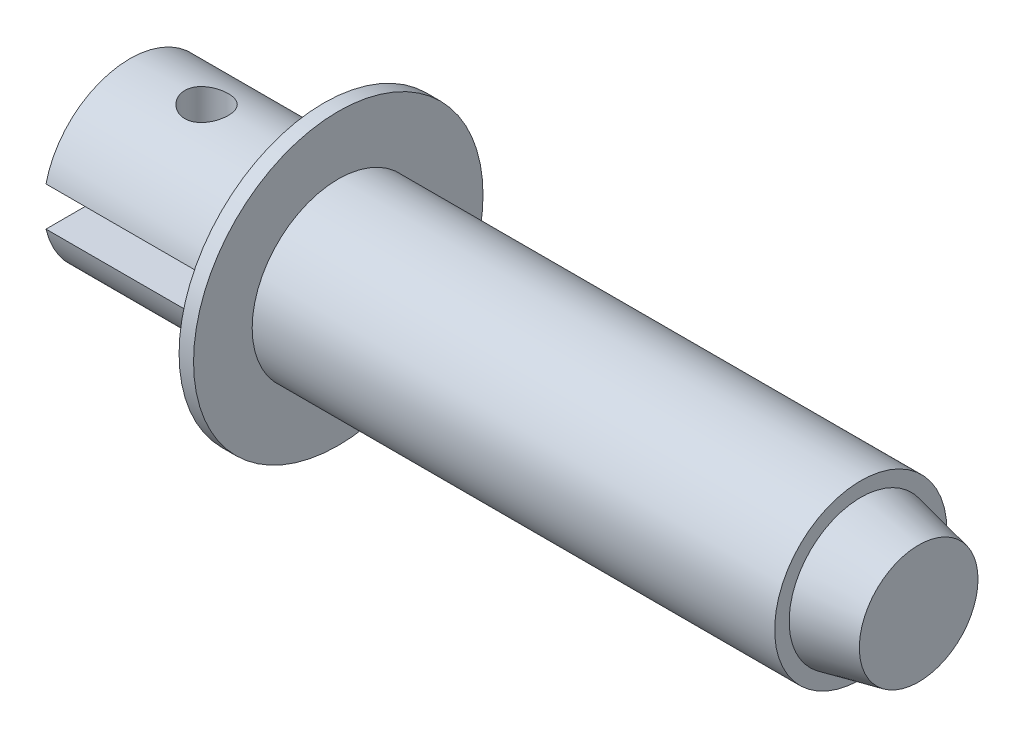
ISO-10303-21;
HEADER;
FILE_DESCRIPTION(('STEP AP214'),'2;1');
FILE_NAME('part.step','',(''),(''),'','','');
FILE_SCHEMA(('AUTOMOTIVE_DESIGN { 1 0 10303 214 1 1 1 1 }'));
ENDSEC;
DATA;
#1=APPLICATION_CONTEXT('core data for automotive mechanical design processes');
#2=APPLICATION_PROTOCOL_DEFINITION('international standard','automotive_design',2000,#1);
#3=PRODUCT_CONTEXT('',#1,'mechanical');
#4=PRODUCT('Part','Part','',(#3));
#5=PRODUCT_RELATED_PRODUCT_CATEGORY('part','',(#4));
#6=PRODUCT_DEFINITION_FORMATION('','',#4);
#7=PRODUCT_DEFINITION_CONTEXT('part definition',#1,'design');
#8=PRODUCT_DEFINITION('design','',#6,#7);
#9=PRODUCT_DEFINITION_SHAPE('','',#8);
#10=(LENGTH_UNIT() NAMED_UNIT(*) SI_UNIT(.MILLI.,.METRE.));
#11=(NAMED_UNIT(*) PLANE_ANGLE_UNIT() SI_UNIT($,.RADIAN.));
#12=(NAMED_UNIT(*) SI_UNIT($,.STERADIAN.) SOLID_ANGLE_UNIT());
#13=UNCERTAINTY_MEASURE_WITH_UNIT(LENGTH_MEASURE(1.E-05),#10,'distance_accuracy_value','');
#14=(GEOMETRIC_REPRESENTATION_CONTEXT(3) GLOBAL_UNCERTAINTY_ASSIGNED_CONTEXT((#13)) GLOBAL_UNIT_ASSIGNED_CONTEXT((#10,
#11,#12)) REPRESENTATION_CONTEXT('',''));
#15=CARTESIAN_POINT('',(0.,0.,0.));
#16=DIRECTION('',(0.,0.,1.));
#17=DIRECTION('',(1.,0.,0.));
#18=AXIS2_PLACEMENT_3D('',#15,#16,#17);
#19=CARTESIAN_POINT('',(54.0592651992453,0.,0.));
#20=DIRECTION('',(1.,0.,0.));
#21=DIRECTION('',(0.,0.,-1.));
#22=AXIS2_PLACEMENT_3D('',#19,#20,#21);
#23=CYLINDRICAL_SURFACE('',#22,5.94999999999999);
#24=CARTESIAN_POINT('',(50.0592651992453,0.,0.));
#25=DIRECTION('',(1.,0.,0.));
#26=DIRECTION('',(0.,0.,-1.));
#27=AXIS2_PLACEMENT_3D('',#24,#25,#26);
#28=CIRCLE('',#27,5.94999999999999);
#29=CARTESIAN_POINT('',(50.0592651992453,0.,-5.94999999999999));
#30=VERTEX_POINT('',#29);
#31=EDGE_CURVE('E206',#30,#30,#28,.T.);
#32=ORIENTED_EDGE('',*,*,#31,.F.);
#33=EDGE_LOOP('',(#32));
#34=FACE_BOUND('',#33,.T.);
#35=CARTESIAN_POINT('',(13.9592651992453,0.,0.));
#36=DIRECTION('',(-1.,0.,0.));
#37=DIRECTION('',(0.,0.,1.));
#38=AXIS2_PLACEMENT_3D('',#35,#36,#37);
#39=CIRCLE('',#38,5.94999999999999);
#40=CARTESIAN_POINT('',(13.9592651992453,0.,5.94999999999999));
#41=VERTEX_POINT('',#40);
#42=EDGE_CURVE('E132',#41,#41,#39,.F.);
#43=ORIENTED_EDGE('',*,*,#42,.T.);
#44=EDGE_LOOP('',(#43));
#45=FACE_BOUND('',#44,.T.);
#46=ADVANCED_FACE('F57',(#34,#45),#23,.T.);
#47=CARTESIAN_POINT('',(50.0592651992453,5.94999999999999,0.));
#48=DIRECTION('',(1.,0.,0.));
#49=DIRECTION('',(0.,0.,-1.));
#50=AXIS2_PLACEMENT_3D('',#47,#48,#49);
#51=PLANE('',#50);
#52=ORIENTED_EDGE('',*,*,#31,.T.);
#53=EDGE_LOOP('',(#52));
#54=FACE_BOUND('',#53,.T.);
#55=CARTESIAN_POINT('',(50.0592651992453,0.,0.));
#56=DIRECTION('',(1.,0.,0.));
#57=DIRECTION('',(0.,0.,-1.));
#58=AXIS2_PLACEMENT_3D('',#55,#56,#57);
#59=CIRCLE('',#58,4.94999999999999);
#60=CARTESIAN_POINT('',(50.0592651992453,0.,-4.94999999999999));
#61=VERTEX_POINT('',#60);
#62=EDGE_CURVE('E209',#61,#61,#59,.T.);
#63=ORIENTED_EDGE('',*,*,#62,.F.);
#64=EDGE_LOOP('',(#63));
#65=FACE_BOUND('',#64,.T.);
#66=ADVANCED_FACE('F195',(#54,#65),#51,.T.);
#67=CARTESIAN_POINT('',(54.0592651992453,0.,0.));
#68=DIRECTION('',(-1.,0.,0.));
#69=DIRECTION('',(0.,0.,1.));
#70=AXIS2_PLACEMENT_3D('',#67,#68,#69);
#71=CONICAL_SURFACE('',#70,4.1,0.209385392953495);
#72=ORIENTED_EDGE('',*,*,#62,.T.);
#73=EDGE_LOOP('',(#72));
#74=FACE_BOUND('',#73,.T.);
#75=CARTESIAN_POINT('',(54.0592651992453,0.,0.));
#76=DIRECTION('',(1.,0.,0.));
#77=DIRECTION('',(0.,0.,-1.));
#78=AXIS2_PLACEMENT_3D('',#75,#76,#77);
#79=CIRCLE('',#78,4.1);
#80=CARTESIAN_POINT('',(54.0592651992453,0.,-4.1));
#81=VERTEX_POINT('',#80);
#82=EDGE_CURVE('E211',#81,#81,#79,.T.);
#83=ORIENTED_EDGE('',*,*,#82,.F.);
#84=EDGE_LOOP('',(#83));
#85=FACE_BOUND('',#84,.T.);
#86=ADVANCED_FACE('F192',(#74,#85),#71,.T.);
#87=CARTESIAN_POINT('',(54.0592651992453,4.1,0.));
#88=DIRECTION('',(1.,0.,0.));
#89=DIRECTION('',(0.,0.,-1.));
#90=AXIS2_PLACEMENT_3D('',#87,#88,#89);
#91=PLANE('',#90);
#92=ORIENTED_EDGE('',*,*,#82,.T.);
#93=EDGE_LOOP('',(#92));
#94=FACE_BOUND('',#93,.T.);
#95=ADVANCED_FACE('F189',(#94),#91,.T.);
#96=CARTESIAN_POINT('',(12.9592651992453,0.,0.));
#97=DIRECTION('',(1.,0.,0.));
#98=DIRECTION('',(0.,0.,-1.));
#99=AXIS2_PLACEMENT_3D('',#96,#97,#98);
#100=PLANE('',#99);
#101=CARTESIAN_POINT('',(12.9592651992453,0.,0.));
#102=DIRECTION('',(1.,0.,0.));
#103=DIRECTION('',(0.,0.,-1.));
#104=AXIS2_PLACEMENT_3D('',#101,#102,#103);
#105=CIRCLE('',#104,5.94999999999999);
#106=CARTESIAN_POINT('',(12.9592651992453,0.,-5.94999999999999));
#107=VERTEX_POINT('',#106);
#108=EDGE_CURVE('E61',#107,#107,#105,.F.);
#109=ORIENTED_EDGE('',*,*,#108,.F.);
#110=EDGE_LOOP('',(#109));
#111=FACE_BOUND('',#110,.T.);
#112=CARTESIAN_POINT('',(12.9592651992453,0.,0.));
#113=DIRECTION('',(-1.,0.,0.));
#114=DIRECTION('',(0.,0.,1.));
#115=AXIS2_PLACEMENT_3D('',#112,#113,#114);
#116=CIRCLE('',#115,10.);
#117=CARTESIAN_POINT('',(12.9592651992453,0.,10.));
#118=VERTEX_POINT('',#117);
#119=EDGE_CURVE('E135',#118,#118,#116,.T.);
#120=ORIENTED_EDGE('',*,*,#119,.T.);
#121=EDGE_LOOP('',(#120));
#122=FACE_BOUND('',#121,.T.);
#123=ADVANCED_FACE('F176',(#111,#122),#100,.F.);
#124=CARTESIAN_POINT('',(0.,0.,0.));
#125=DIRECTION('',(-1.,0.,0.));
#126=DIRECTION('',(0.,0.,1.));
#127=AXIS2_PLACEMENT_3D('',#124,#125,#126);
#128=CYLINDRICAL_SURFACE('',#127,10.);
#129=ORIENTED_EDGE('',*,*,#119,.F.);
#130=EDGE_LOOP('',(#129));
#131=FACE_BOUND('',#130,.T.);
#132=CARTESIAN_POINT('',(13.9592651992453,0.,0.));
#133=DIRECTION('',(-1.,0.,0.));
#134=DIRECTION('',(0.,0.,1.));
#135=AXIS2_PLACEMENT_3D('',#132,#133,#134);
#136=CIRCLE('',#135,10.);
#137=CARTESIAN_POINT('',(13.9592651992453,0.,10.));
#138=VERTEX_POINT('',#137);
#139=EDGE_CURVE('E142',#138,#138,#136,.T.);
#140=ORIENTED_EDGE('',*,*,#139,.T.);
#141=EDGE_LOOP('',(#140));
#142=FACE_BOUND('',#141,.T.);
#143=ADVANCED_FACE('F258',(#131,#142),#128,.T.);
#144=CARTESIAN_POINT('',(13.9592651992453,0.,0.));
#145=DIRECTION('',(-1.,0.,0.));
#146=DIRECTION('',(0.,0.,1.));
#147=AXIS2_PLACEMENT_3D('',#144,#145,#146);
#148=PLANE('',#147);
#149=ORIENTED_EDGE('',*,*,#42,.F.);
#150=EDGE_LOOP('',(#149));
#151=FACE_BOUND('',#150,.T.);
#152=ORIENTED_EDGE('',*,*,#139,.F.);
#153=EDGE_LOOP('',(#152));
#154=FACE_BOUND('',#153,.T.);
#155=ADVANCED_FACE('F173',(#151,#154),#148,.F.);
#156=CARTESIAN_POINT('',(4.85926519924531,10.,0.));
#157=DIRECTION('',(0.,-1.,0.));
#158=DIRECTION('',(0.,0.,-1.));
#159=AXIS2_PLACEMENT_3D('',#156,#157,#158);
#160=CYLINDRICAL_SURFACE('',#159,1.5);
#161=CARTESIAN_POINT('',(4.85926519924531,-5.75782076831156,-1.5));
#162=CARTESIAN_POINT('',(4.77645903429275,-5.75782233494608,-1.49999768871238));
#163=CARTESIAN_POINT('',(4.69362743513037,-5.75962659429058,-1.49311978240876));
#164=CARTESIAN_POINT('',(4.53034455081416,-5.76662986683459,-1.4658347600793));
#165=CARTESIAN_POINT('',(4.44989465482709,-5.77183082196396,-1.4454199047225));
#166=CARTESIAN_POINT('',(4.29376062505762,-5.7850018540609,-1.39176505830194));
#167=CARTESIAN_POINT('',(4.21807042133364,-5.79296831602231,-1.35854180384155));
#168=CARTESIAN_POINT('',(4.07332935718372,-5.81076822901485,-1.28026440234075));
#169=CARTESIAN_POINT('',(4.00427880799135,-5.82060176750091,-1.23520970107066));
#170=CARTESIAN_POINT('',(3.87323221356503,-5.84127417142639,-1.13347144633303));
#171=CARTESIAN_POINT('',(3.81140663814935,-5.852129319229,-1.07657158002437));
#172=CARTESIAN_POINT('',(3.69806742909559,-5.87348068088483,-0.953224007108163));
#173=CARTESIAN_POINT('',(3.64655477200139,-5.88397686066895,-0.886775397339861));
#174=CARTESIAN_POINT('',(3.55460455913966,-5.90360798591028,-0.745046980007372));
#175=CARTESIAN_POINT('',(3.51433471610184,-5.91272147754515,-0.669655135303468));
#176=CARTESIAN_POINT('',(3.44710413018627,-5.92837449499029,-0.512904027550644));
#177=CARTESIAN_POINT('',(3.42014138944441,-5.93491440715546,-0.431545662394265));
#178=CARTESIAN_POINT('',(3.38083710131033,-5.94456828641699,-0.266948406817762));
#179=CARTESIAN_POINT('',(3.36820600726063,-5.94775000410433,-0.183782699911668));
#180=CARTESIAN_POINT('',(3.35701443496939,-5.95056519154128,-0.0164559237692994));
#181=CARTESIAN_POINT('',(3.35845184272211,-5.95019919438891,0.067704994023195));
#182=CARTESIAN_POINT('',(3.37514875738711,-5.94601052596881,0.232624117632467));
#183=CARTESIAN_POINT('',(3.39009569069909,-5.94226602741367,0.313416254189624));
#184=CARTESIAN_POINT('',(3.43288463073708,-5.93183226465852,0.471306468441187));
#185=CARTESIAN_POINT('',(3.4607273303278,-5.92514284223438,0.548404347404613));
#186=CARTESIAN_POINT('',(3.5287687046805,-5.90945172411485,0.697537874248503));
#187=CARTESIAN_POINT('',(3.5690781069372,-5.90042943091867,0.769520747132065));
#188=CARTESIAN_POINT('',(3.66082453441358,-5.88105044710891,0.905809634403645));
#189=CARTESIAN_POINT('',(3.71226352470601,-5.87069352097939,0.97011428998757));
#190=CARTESIAN_POINT('',(3.82648258773059,-5.84943692140127,1.09108572538244));
#191=CARTESIAN_POINT('',(3.88953573924289,-5.83853015514327,1.14749370224276));
#192=CARTESIAN_POINT('',(4.024320573024,-5.81766341566798,1.24899361099793));
#193=CARTESIAN_POINT('',(4.09605267485877,-5.80770348826525,1.29408499549124));
#194=CARTESIAN_POINT('',(4.24667341228633,-5.78983234742103,1.37184123304776));
#195=CARTESIAN_POINT('',(4.32559605024814,-5.78193163088577,1.40444280016486));
#196=CARTESIAN_POINT('',(4.48804947940472,-5.76920756152377,1.45583400038077));
#197=CARTESIAN_POINT('',(4.57157926128624,-5.76438353755494,1.47462664585967));
#198=CARTESIAN_POINT('',(4.73847327932715,-5.75850017235608,1.49743510422221));
#199=CARTESIAN_POINT('',(4.82178178478398,-5.75734326195707,1.50183399029071));
#200=CARTESIAN_POINT('',(4.987942804511,-5.75865936105512,1.49677962599947));
#201=CARTESIAN_POINT('',(5.07079536081536,-5.76113203011553,1.48732767478012));
#202=CARTESIAN_POINT('',(5.23226360472499,-5.76933509320013,1.45517605430573));
#203=CARTESIAN_POINT('',(5.31092694617142,-5.77501038251313,1.43270030307497));
#204=CARTESIAN_POINT('',(5.46336919335856,-5.78892671981358,1.37538778324766));
#205=CARTESIAN_POINT('',(5.53714751174711,-5.79716807565594,1.34054953143309));
#206=CARTESIAN_POINT('',(5.67934601188652,-5.81549274421368,1.25870211192783));
#207=CARTESIAN_POINT('',(5.74763025507234,-5.82560946549266,1.21146441620507));
#208=CARTESIAN_POINT('',(5.87544350364458,-5.84646341851985,1.10644727101093));
#209=CARTESIAN_POINT('',(5.93497104183937,-5.85720075383349,1.04866605859182));
#210=CARTESIAN_POINT('',(6.04513759264136,-5.87841742128495,0.922442319036813));
#211=CARTESIAN_POINT('',(6.09551134199489,-5.88888319927537,0.853765566559674));
#212=CARTESIAN_POINT('',(6.18401165363835,-5.90809451049534,0.708705846793871));
#213=CARTESIAN_POINT('',(6.22213885741658,-5.91684013381928,0.632323283420051));
#214=CARTESIAN_POINT('',(6.28473009757157,-5.93157038923434,0.474550020021314));
#215=CARTESIAN_POINT('',(6.309292978363,-5.93757493855684,0.393200480838868));
#216=CARTESIAN_POINT('',(6.34435393489769,-5.94623375048927,0.227356564063107));
#217=CARTESIAN_POINT('',(6.35485477393585,-5.94888867131996,0.142862807686707));
#218=CARTESIAN_POINT('',(6.36133593831114,-5.9505217030976,-0.0243807825053444));
#219=CARTESIAN_POINT('',(6.35770743484987,-5.94959886746452,-0.107114717761271));
#220=CARTESIAN_POINT('',(6.33693039086541,-5.94440026733244,-0.270753753592761));
#221=CARTESIAN_POINT('',(6.31978226490589,-5.94012460564403,-0.35165891016747));
#222=CARTESIAN_POINT('',(6.27266399686357,-5.9287166320068,-0.508926820324035));
#223=CARTESIAN_POINT('',(6.24276565478803,-5.92160033063149,-0.58531232285441));
#224=CARTESIAN_POINT('',(6.17106063644264,-5.90525977473839,-0.73202592192532));
#225=CARTESIAN_POINT('',(6.12925243700526,-5.89603525062704,-0.802353242177572));
#226=CARTESIAN_POINT('',(6.03372741084679,-5.87619190076881,-0.936804832205172));
#227=CARTESIAN_POINT('',(5.97974591715321,-5.86554464290917,-1.00073686496424));
#228=CARTESIAN_POINT('',(5.86191902957474,-5.84418209657474,-1.11876772120989));
#229=CARTESIAN_POINT('',(5.79807112776611,-5.83346679146906,-1.17286403694311));
#230=CARTESIAN_POINT('',(5.66085933358169,-5.81294857955094,-1.27070101081858));
#231=CARTESIAN_POINT('',(5.5873372901462,-5.80316695036892,-1.31422468836178));
#232=CARTESIAN_POINT('',(5.43378337056507,-5.78591158942592,-1.38822949660823));
#233=CARTESIAN_POINT('',(5.35375622257077,-5.77843620002402,-1.41872000118598));
#234=CARTESIAN_POINT('',(5.20478420963696,-5.76779217545035,-1.46132037834492));
#235=CARTESIAN_POINT('',(5.13654434220757,-5.76408129197266,-1.47579332540437));
#236=CARTESIAN_POINT('',(4.99863063658055,-5.75909503692319,-1.4951336837741));
#237=CARTESIAN_POINT('',(4.92895692585034,-5.75781944979301,-1.50000194523711));
#238=CARTESIAN_POINT('',(4.85926519924531,-5.75782076831156,-1.5));
#239=B_SPLINE_CURVE_WITH_KNOTS('',3,(#161,#162,#163,#164,#165,#166,#167,#168,#169,#170,#171,
#172,#173,#174,#175,#176,#177,#178,#179,#180,#181,#182,#183,#184,#185,#186,#187,#188,#189,#190,
#191,#192,#193,#194,#195,#196,#197,#198,#199,#200,#201,#202,#203,#204,#205,#206,#207,#208,#209,
#210,#211,#212,#213,#214,#215,#216,#217,#218,#219,#220,#221,#222,#223,#224,#225,#226,#227,#228,
#229,#230,#231,#232,#233,#234,#235,#236,#237,#238),.UNSPECIFIED.,.T.,.F.,(4,2,2,2,2,2,2,2,2,2,2,
2,2,2,2,2,2,2,2,2,2,2,2,2,2,2,2,2,2,2,2,2,2,2,2,2,2,2,4),(0.,0.24816252440501,0.496467050509526,
0.744448213372957,0.99244099468389,1.24543802607959,1.49845900277979,1.75507407358384,
2.01165060571106,2.26294561163234,2.51420285724788,2.75979145951352,3.00539325831315,
3.25324234223002,3.50113522287185,3.75584806293773,4.01057322149467,4.26657252022555,
4.5225159567871,4.77158985386634,5.02064039053487,5.26553095551585,5.51045091171653,
5.76024757088363,6.01008603608886,6.26629324643614,6.5224870341623,6.77678841394287,
7.03103981429034,7.27830297848152,7.52555856092681,7.77143979209797,8.01735248347586,
8.2692402221725,8.52119209338009,8.77794514182155,9.03451321327094,9.24339145154696,
9.45225120026682),.UNSPECIFIED.);
#240=CARTESIAN_POINT('',(4.85926519924531,-5.75782076831156,-1.5));
#241=VERTEX_POINT('',#240);
#242=EDGE_CURVE('E153',#241,#241,#239,.T.);
#243=ORIENTED_EDGE('',*,*,#242,.F.);
#244=EDGE_LOOP('',(#243));
#245=FACE_BOUND('',#244,.T.);
#246=CARTESIAN_POINT('',(4.85926519924531,-1.35,0.));
#247=DIRECTION('',(0.,1.,0.));
#248=DIRECTION('',(-1.,0.,0.));
#249=AXIS2_PLACEMENT_3D('',#246,#247,#248);
#250=CIRCLE('',#249,1.5);
#251=CARTESIAN_POINT('',(3.35926519924532,-1.35,0.));
#252=VERTEX_POINT('',#251);
#253=EDGE_CURVE('E131',#252,#252,#250,.F.);
#254=ORIENTED_EDGE('',*,*,#253,.F.);
#255=EDGE_LOOP('',(#254));
#256=FACE_BOUND('',#255,.T.);
#257=ADVANCED_FACE('F168',(#245,#256),#160,.F.);
#258=CARTESIAN_POINT('',(-0.44073480075468,5.94999999999999,0.));
#259=DIRECTION('',(-1.,0.,0.));
#260=DIRECTION('',(0.,0.,1.));
#261=AXIS2_PLACEMENT_3D('',#258,#259,#260);
#262=PLANE('',#261);
#263=DIRECTION('',(0.,0.,-1.));
#264=VECTOR('',#263,1.);
#265=CARTESIAN_POINT('',(-0.440734800754684,1.35,10.));
#266=LINE('',#265,#264);
#267=CARTESIAN_POINT('',(-0.440734800754684,1.35,5.79482527778016));
#268=VERTEX_POINT('',#267);
#269=CARTESIAN_POINT('',(-0.440734800754683,1.35,-5.79482527778016));
#270=VERTEX_POINT('',#269);
#271=EDGE_CURVE('E75',#268,#270,#266,.T.);
#272=ORIENTED_EDGE('',*,*,#271,.F.);
#273=CARTESIAN_POINT('',(-0.440734800754683,0.,0.));
#274=DIRECTION('',(1.,0.,0.));
#275=DIRECTION('',(0.,0.,-1.));
#276=AXIS2_PLACEMENT_3D('',#273,#274,#275);
#277=CIRCLE('',#276,5.94999999999999);
#278=EDGE_CURVE('E122',#270,#268,#277,.T.);
#279=ORIENTED_EDGE('',*,*,#278,.F.);
#280=EDGE_LOOP('',(#272,#279));
#281=FACE_BOUND('',#280,.T.);
#282=ADVANCED_FACE('F59',(#281),#262,.T.);
#283=CARTESIAN_POINT('',(-0.440734800754684,1.35,10.));
#284=DIRECTION('',(0.,1.,0.));
#285=DIRECTION('',(0.,0.,1.));
#286=AXIS2_PLACEMENT_3D('',#283,#284,#285);
#287=PLANE('',#286);
#288=CARTESIAN_POINT('',(4.85926519924531,1.35,0.));
#289=DIRECTION('',(0.,1.,0.));
#290=DIRECTION('',(0.,0.,1.));
#291=AXIS2_PLACEMENT_3D('',#288,#289,#290);
#292=CIRCLE('',#291,1.5);
#293=CARTESIAN_POINT('',(4.85926519924531,1.35,1.5));
#294=VERTEX_POINT('',#293);
#295=EDGE_CURVE('E128',#294,#294,#292,.F.);
#296=ORIENTED_EDGE('',*,*,#295,.F.);
#297=EDGE_LOOP('',(#296));
#298=FACE_BOUND('',#297,.T.);
#299=DIRECTION('',(1.,0.,0.));
#300=VECTOR('',#299,1.);
#301=CARTESIAN_POINT('',(54.0592651992453,1.35,5.79482527778016));
#302=LINE('',#301,#300);
#303=CARTESIAN_POINT('',(11.4592651992453,1.35,5.79482527778016));
#304=VERTEX_POINT('',#303);
#305=EDGE_CURVE('E111',#304,#268,#302,.F.);
#306=ORIENTED_EDGE('',*,*,#305,.T.);
#307=ORIENTED_EDGE('',*,*,#271,.T.);
#308=DIRECTION('',(1.,0.,0.));
#309=VECTOR('',#308,1.);
#310=CARTESIAN_POINT('',(54.0592651992453,1.35,-5.79482527778016));
#311=LINE('',#310,#309);
#312=CARTESIAN_POINT('',(11.4592651992453,1.35,-5.79482527778016));
#313=VERTEX_POINT('',#312);
#314=EDGE_CURVE('E115',#270,#313,#311,.T.);
#315=ORIENTED_EDGE('',*,*,#314,.T.);
#316=DIRECTION('',(0.,0.,-1.));
#317=VECTOR('',#316,1.);
#318=CARTESIAN_POINT('',(11.4592651992453,1.35,10.));
#319=LINE('',#318,#317);
#320=EDGE_CURVE('E105',#304,#313,#319,.T.);
#321=ORIENTED_EDGE('',*,*,#320,.F.);
#322=EDGE_LOOP('',(#306,#307,#315,#321));
#323=FACE_BOUND('',#322,.T.);
#324=ADVANCED_FACE('F114',(#298,#323),#287,.F.);
#325=CARTESIAN_POINT('',(-0.440734800754683,-1.35,5.79482527778017));
#326=VERTEX_POINT('',#325);
#327=CARTESIAN_POINT('',(-0.440734800754683,-1.35,-5.79482527778017));
#328=VERTEX_POINT('',#327);
#329=EDGE_CURVE('E215',#326,#328,#277,.T.);
#330=ORIENTED_EDGE('',*,*,#329,.F.);
#331=DIRECTION('',(0.,0.,-1.));
#332=VECTOR('',#331,1.);
#333=CARTESIAN_POINT('',(-0.440734800754683,-1.35,10.));
#334=LINE('',#333,#332);
#335=EDGE_CURVE('E218',#326,#328,#334,.T.);
#336=ORIENTED_EDGE('',*,*,#335,.T.);
#337=EDGE_LOOP('',(#330,#336));
#338=FACE_BOUND('',#337,.T.);
#339=ADVANCED_FACE('F181',(#338),#262,.T.);
#340=CARTESIAN_POINT('',(-0.440734800754683,-1.35,10.));
#341=DIRECTION('',(0.,1.,0.));
#342=DIRECTION('',(-1.,0.,0.));
#343=AXIS2_PLACEMENT_3D('',#340,#341,#342);
#344=PLANE('',#343);
#345=ORIENTED_EDGE('',*,*,#253,.T.);
#346=EDGE_LOOP('',(#345));
#347=FACE_BOUND('',#346,.T.);
#348=DIRECTION('',(0.,0.,-1.));
#349=VECTOR('',#348,1.);
#350=CARTESIAN_POINT('',(11.4592651992453,-1.34999999999999,10.));
#351=LINE('',#350,#349);
#352=CARTESIAN_POINT('',(11.4592651992453,-1.34999999999999,5.79482527778016));
#353=VERTEX_POINT('',#352);
#354=CARTESIAN_POINT('',(11.4592651992453,-1.34999999999999,-5.79482527778016));
#355=VERTEX_POINT('',#354);
#356=EDGE_CURVE('E107',#353,#355,#351,.T.);
#357=ORIENTED_EDGE('',*,*,#356,.T.);
#358=DIRECTION('',(1.,0.,0.));
#359=VECTOR('',#358,1.);
#360=CARTESIAN_POINT('',(54.0592651992453,-1.34999999999997,-5.79482527778017));
#361=LINE('',#360,#359);
#362=EDGE_CURVE('E83',#328,#355,#361,.T.);
#363=ORIENTED_EDGE('',*,*,#362,.F.);
#364=ORIENTED_EDGE('',*,*,#335,.F.);
#365=DIRECTION('',(1.,0.,0.));
#366=VECTOR('',#365,1.);
#367=CARTESIAN_POINT('',(54.0592651992453,-1.34999999999997,5.79482527778017));
#368=LINE('',#367,#366);
#369=EDGE_CURVE('E12',#353,#326,#368,.F.);
#370=ORIENTED_EDGE('',*,*,#369,.F.);
#371=EDGE_LOOP('',(#357,#363,#364,#370));
#372=FACE_BOUND('',#371,.T.);
#373=ADVANCED_FACE('F185',(#347,#372),#344,.T.);
#374=CARTESIAN_POINT('',(11.4592651992453,1.35,10.));
#375=DIRECTION('',(1.,0.,0.));
#376=DIRECTION('',(0.,0.,-1.));
#377=AXIS2_PLACEMENT_3D('',#374,#375,#376);
#378=PLANE('',#377);
#379=CARTESIAN_POINT('',(11.4592651992453,0.,0.));
#380=DIRECTION('',(1.,0.,0.));
#381=DIRECTION('',(0.,0.,-1.));
#382=AXIS2_PLACEMENT_3D('',#379,#380,#381);
#383=CIRCLE('',#382,5.94999999999999);
#384=EDGE_CURVE('E67',#353,#304,#383,.F.);
#385=ORIENTED_EDGE('',*,*,#384,.T.);
#386=ORIENTED_EDGE('',*,*,#320,.T.);
#387=EDGE_CURVE('E113',#313,#355,#383,.F.);
#388=ORIENTED_EDGE('',*,*,#387,.T.);
#389=ORIENTED_EDGE('',*,*,#356,.F.);
#390=EDGE_LOOP('',(#385,#386,#388,#389));
#391=FACE_BOUND('',#390,.T.);
#392=ADVANCED_FACE('F104',(#391),#378,.F.);
#393=CARTESIAN_POINT('',(4.85926519924531,5.75782076831156,-1.5));
#394=CARTESIAN_POINT('',(4.94207136419787,5.75782233494608,-1.49999768871238));
#395=CARTESIAN_POINT('',(5.02490296336026,5.75962659429058,-1.49311978240876));
#396=CARTESIAN_POINT('',(5.18818584767647,5.76662986683459,-1.4658347600793));
#397=CARTESIAN_POINT('',(5.26863574366354,5.77183082196396,-1.4454199047225));
#398=CARTESIAN_POINT('',(5.42476977343301,5.7850018540609,-1.39176505830194));
#399=CARTESIAN_POINT('',(5.50045997715699,5.79296831602231,-1.35854180384155));
#400=CARTESIAN_POINT('',(5.64520104130691,5.81076822901485,-1.28026440234075));
#401=CARTESIAN_POINT('',(5.71425159049927,5.82060176750091,-1.23520970107066));
#402=CARTESIAN_POINT('',(5.8452981849256,5.84127417142639,-1.13347144633303));
#403=CARTESIAN_POINT('',(5.90712376034128,5.852129319229,-1.07657158002437));
#404=CARTESIAN_POINT('',(6.02046296939504,5.87348068088483,-0.953224007108162));
#405=CARTESIAN_POINT('',(6.07197562648924,5.88397686066895,-0.886775397339861));
#406=CARTESIAN_POINT('',(6.16392583935097,5.90360798591028,-0.745046980007372));
#407=CARTESIAN_POINT('',(6.20419568238878,5.91272147754515,-0.669655135303468));
#408=CARTESIAN_POINT('',(6.27142626830436,5.92837449499029,-0.512904027550644));
#409=CARTESIAN_POINT('',(6.29838900904622,5.93491440715546,-0.431545662394264));
#410=CARTESIAN_POINT('',(6.3376932971803,5.94456828641699,-0.266948406817761));
#411=CARTESIAN_POINT('',(6.35032439123,5.94775000410433,-0.183782699911668));
#412=CARTESIAN_POINT('',(6.36151596352124,5.95056519154128,-0.0164559237692992));
#413=CARTESIAN_POINT('',(6.36007855576852,5.95019919438891,0.0677049940231951));
#414=CARTESIAN_POINT('',(6.34338164110352,5.94601052596881,0.232624117632467));
#415=CARTESIAN_POINT('',(6.32843470779154,5.94226602741367,0.313416254189624));
#416=CARTESIAN_POINT('',(6.28564576775355,5.93183226465852,0.471306468441187));
#417=CARTESIAN_POINT('',(6.25780306816283,5.92514284223438,0.548404347404612));
#418=CARTESIAN_POINT('',(6.18976169381012,5.90945172411485,0.697537874248503));
#419=CARTESIAN_POINT('',(6.14945229155343,5.90042943091867,0.769520747132066));
#420=CARTESIAN_POINT('',(6.05770586407705,5.88105044710891,0.905809634403646));
#421=CARTESIAN_POINT('',(6.00626687378462,5.87069352097939,0.97011428998757));
#422=CARTESIAN_POINT('',(5.89204781076004,5.84943692140127,1.09108572538244));
#423=CARTESIAN_POINT('',(5.82899465924774,5.83853015514327,1.14749370224276));
#424=CARTESIAN_POINT('',(5.69420982546663,5.81766341566798,1.24899361099793));
#425=CARTESIAN_POINT('',(5.62247772363186,5.80770348826525,1.29408499549124));
#426=CARTESIAN_POINT('',(5.4718569862043,5.78983234742103,1.37184123304776));
#427=CARTESIAN_POINT('',(5.39293434824249,5.78193163088577,1.40444280016486));
#428=CARTESIAN_POINT('',(5.23048091908591,5.76920756152377,1.45583400038077));
#429=CARTESIAN_POINT('',(5.14695113720439,5.76438353755494,1.47462664585967));
#430=CARTESIAN_POINT('',(4.98005711916348,5.75850017235608,1.49743510422221));
#431=CARTESIAN_POINT('',(4.89674861370665,5.75734326195707,1.50183399029071));
#432=CARTESIAN_POINT('',(4.73058759397963,5.75865936105512,1.49677962599947));
#433=CARTESIAN_POINT('',(4.64773503767527,5.76113203011553,1.48732767478012));
#434=CARTESIAN_POINT('',(4.48626679376564,5.76933509320013,1.45517605430573));
#435=CARTESIAN_POINT('',(4.40760345231921,5.77501038251313,1.43270030307497));
#436=CARTESIAN_POINT('',(4.25516120513207,5.78892671981358,1.37538778324766));
#437=CARTESIAN_POINT('',(4.18138288674352,5.79716807565594,1.34054953143309));
#438=CARTESIAN_POINT('',(4.03918438660411,5.81549274421368,1.25870211192783));
#439=CARTESIAN_POINT('',(3.97090014341829,5.82560946549266,1.21146441620507));
#440=CARTESIAN_POINT('',(3.84308689484605,5.84646341851985,1.10644727101093));
#441=CARTESIAN_POINT('',(3.78355935665126,5.85720075383349,1.04866605859182));
#442=CARTESIAN_POINT('',(3.67339280584927,5.87841742128495,0.922442319036813));
#443=CARTESIAN_POINT('',(3.62301905649574,5.88888319927537,0.853765566559674));
#444=CARTESIAN_POINT('',(3.53451874485227,5.90809451049534,0.70870584679387));
#445=CARTESIAN_POINT('',(3.49639154107404,5.91684013381928,0.632323283420051));
#446=CARTESIAN_POINT('',(3.43380030091906,5.93157038923434,0.474550020021313));
#447=CARTESIAN_POINT('',(3.40923742012763,5.93757493855684,0.393200480838868));
#448=CARTESIAN_POINT('',(3.37417646359294,5.94623375048927,0.227356564063107));
#449=CARTESIAN_POINT('',(3.36367562455478,5.94888867131996,0.142862807686707));
#450=CARTESIAN_POINT('',(3.35719446017949,5.9505217030976,-0.0243807825053441));
#451=CARTESIAN_POINT('',(3.36082296364075,5.94959886746452,-0.107114717761271));
#452=CARTESIAN_POINT('',(3.38160000762522,5.94440026733244,-0.27075375359276));
#453=CARTESIAN_POINT('',(3.39874813358474,5.94012460564403,-0.35165891016747));
#454=CARTESIAN_POINT('',(3.44586640162706,5.92871663200681,-0.508926820324035));
#455=CARTESIAN_POINT('',(3.4757647437026,5.92160033063149,-0.58531232285441));
#456=CARTESIAN_POINT('',(3.54746976204799,5.90525977473839,-0.732025921925321));
#457=CARTESIAN_POINT('',(3.58927796148537,5.89603525062704,-0.802353242177573));
#458=CARTESIAN_POINT('',(3.68480298764383,5.87619190076881,-0.936804832205172));
#459=CARTESIAN_POINT('',(3.73878448133742,5.86554464290917,-1.00073686496424));
#460=CARTESIAN_POINT('',(3.85661136891588,5.84418209657474,-1.11876772120989));
#461=CARTESIAN_POINT('',(3.92045927072452,5.83346679146906,-1.17286403694311));
#462=CARTESIAN_POINT('',(4.05767106490894,5.81294857955094,-1.27070101081858));
#463=CARTESIAN_POINT('',(4.13119310834443,5.80316695036892,-1.31422468836178));
#464=CARTESIAN_POINT('',(4.28474702792556,5.78591158942592,-1.38822949660823));
#465=CARTESIAN_POINT('',(4.36477417591986,5.77843620002402,-1.41872000118598));
#466=CARTESIAN_POINT('',(4.51374618885367,5.76779217545035,-1.46132037834492));
#467=CARTESIAN_POINT('',(4.58198605628306,5.76408129197266,-1.47579332540437));
#468=CARTESIAN_POINT('',(4.71989976191008,5.75909503692319,-1.4951336837741));
#469=CARTESIAN_POINT('',(4.78957347264029,5.75781944979301,-1.50000194523711));
#470=CARTESIAN_POINT('',(4.85926519924531,5.75782076831156,-1.5));
#471=B_SPLINE_CURVE_WITH_KNOTS('',3,(#393,#394,#395,#396,#397,#398,#399,#400,#401,#402,#403,
#404,#405,#406,#407,#408,#409,#410,#411,#412,#413,#414,#415,#416,#417,#418,#419,#420,#421,#422,
#423,#424,#425,#426,#427,#428,#429,#430,#431,#432,#433,#434,#435,#436,#437,#438,#439,#440,#441,
#442,#443,#444,#445,#446,#447,#448,#449,#450,#451,#452,#453,#454,#455,#456,#457,#458,#459,#460,
#461,#462,#463,#464,#465,#466,#467,#468,#469,#470),.UNSPECIFIED.,.T.,.F.,(4,2,2,2,2,2,2,2,2,2,2,
2,2,2,2,2,2,2,2,2,2,2,2,2,2,2,2,2,2,2,2,2,2,2,2,2,2,2,4),(0.,0.24816252440501,0.496467050509526,
0.744448213372957,0.99244099468389,1.24543802607959,1.49845900277979,1.75507407358384,
2.01165060571106,2.26294561163234,2.51420285724788,2.75979145951352,3.00539325831315,
3.25324234223002,3.50113522287185,3.75584806293773,4.01057322149467,4.26657252022555,
4.5225159567871,4.77158985386633,5.02064039053487,5.26553095551585,5.51045091171653,
5.76024757088363,6.01008603608886,6.26629324643614,6.52248703416231,6.77678841394288,
7.03103981429034,7.27830297848152,7.52555856092682,7.77143979209798,8.01735248347586,
8.2692402221725,8.52119209338009,8.77794514182155,9.03451321327094,9.24339145154696,
9.45225120026682),.UNSPECIFIED.);
#472=CARTESIAN_POINT('',(4.85926519924531,5.75782076831156,-1.5));
#473=VERTEX_POINT('',#472);
#474=EDGE_CURVE('E161',#473,#473,#471,.T.);
#475=ORIENTED_EDGE('',*,*,#474,.F.);
#476=EDGE_LOOP('',(#475));
#477=FACE_BOUND('',#476,.T.);
#478=ORIENTED_EDGE('',*,*,#295,.T.);
#479=EDGE_LOOP('',(#478));
#480=FACE_BOUND('',#479,.T.);
#481=ADVANCED_FACE('F175',(#477,#480),#160,.F.);
#482=ORIENTED_EDGE('',*,*,#474,.T.);
#483=EDGE_LOOP('',(#482));
#484=FACE_BOUND('',#483,.T.);
#485=ORIENTED_EDGE('',*,*,#384,.F.);
#486=ORIENTED_EDGE('',*,*,#369,.T.);
#487=ORIENTED_EDGE('',*,*,#329,.T.);
#488=ORIENTED_EDGE('',*,*,#362,.T.);
#489=ORIENTED_EDGE('',*,*,#387,.F.);
#490=ORIENTED_EDGE('',*,*,#314,.F.);
#491=ORIENTED_EDGE('',*,*,#278,.T.);
#492=ORIENTED_EDGE('',*,*,#305,.F.);
#493=EDGE_LOOP('',(#485,#486,#487,#488,#489,#490,#491,#492));
#494=FACE_BOUND('',#493,.T.);
#495=ORIENTED_EDGE('',*,*,#242,.T.);
#496=EDGE_LOOP('',(#495));
#497=FACE_BOUND('',#496,.T.);
#498=ORIENTED_EDGE('',*,*,#108,.T.);
#499=EDGE_LOOP('',(#498));
#500=FACE_BOUND('',#499,.T.);
#501=ADVANCED_FACE('F119',(#484,#494,#497,#500),#23,.T.);
#502=CLOSED_SHELL('',(#46,#66,#86,#95,#123,#143,#155,#257,#282,#324,#339,#373,#392,#481,#501));
#503=MANIFOLD_SOLID_BREP('B2',#502);
#504=ADVANCED_BREP_SHAPE_REPRESENTATION('',(#18,#503),#14);
#505=SHAPE_DEFINITION_REPRESENTATION(#9,#504);
ENDSEC;
END-ISO-10303-21;
